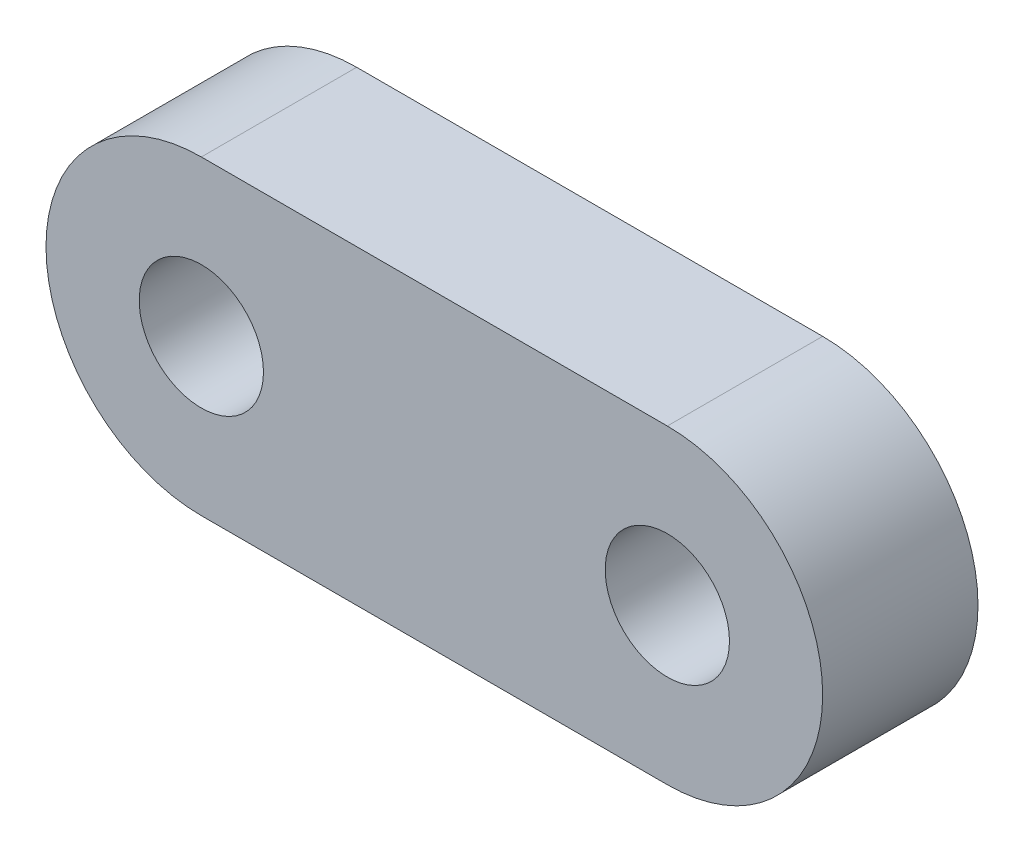
ISO-10303-21;
HEADER;
FILE_DESCRIPTION(('STEP AP214'),'2;1');
FILE_NAME('part.step','',(''),(''),'','','');
FILE_SCHEMA(('AUTOMOTIVE_DESIGN { 1 0 10303 214 1 1 1 1 }'));
ENDSEC;
DATA;
#1=APPLICATION_CONTEXT('core data for automotive mechanical design processes');
#2=APPLICATION_PROTOCOL_DEFINITION('international standard','automotive_design',2000,#1);
#3=PRODUCT_CONTEXT('',#1,'mechanical');
#4=PRODUCT('Part','Part','',(#3));
#5=PRODUCT_RELATED_PRODUCT_CATEGORY('part','',(#4));
#6=PRODUCT_DEFINITION_FORMATION('','',#4);
#7=PRODUCT_DEFINITION_CONTEXT('part definition',#1,'design');
#8=PRODUCT_DEFINITION('design','',#6,#7);
#9=PRODUCT_DEFINITION_SHAPE('','',#8);
#10=(LENGTH_UNIT() NAMED_UNIT(*) SI_UNIT(.MILLI.,.METRE.));
#11=(NAMED_UNIT(*) PLANE_ANGLE_UNIT() SI_UNIT($,.RADIAN.));
#12=(NAMED_UNIT(*) SI_UNIT($,.STERADIAN.) SOLID_ANGLE_UNIT());
#13=UNCERTAINTY_MEASURE_WITH_UNIT(LENGTH_MEASURE(1.E-05),#10,'distance_accuracy_value','');
#14=(GEOMETRIC_REPRESENTATION_CONTEXT(3) GLOBAL_UNCERTAINTY_ASSIGNED_CONTEXT((#13)) GLOBAL_UNIT_ASSIGNED_CONTEXT((#10,
#11,#12)) REPRESENTATION_CONTEXT('',''));
#15=CARTESIAN_POINT('',(0.,0.,0.));
#16=DIRECTION('',(0.,0.,1.));
#17=DIRECTION('',(1.,0.,0.));
#18=AXIS2_PLACEMENT_3D('',#15,#16,#17);
#19=CARTESIAN_POINT('',(-7.5,0.,2.5));
#20=DIRECTION('',(0.,0.,1.));
#21=DIRECTION('',(1.,0.,0.));
#22=AXIS2_PLACEMENT_3D('',#19,#20,#21);
#23=PLANE('',#22);
#24=CARTESIAN_POINT('',(7.5,0.,2.5));
#25=DIRECTION('',(0.,0.,1.));
#26=DIRECTION('',(1.,0.,0.));
#27=AXIS2_PLACEMENT_3D('',#24,#25,#26);
#28=CIRCLE('',#27,2.);
#29=CARTESIAN_POINT('',(9.5,0.,2.5));
#30=VERTEX_POINT('',#29);
#31=EDGE_CURVE('E112',#30,#30,#28,.T.);
#32=ORIENTED_EDGE('',*,*,#31,.F.);
#33=EDGE_LOOP('',(#32));
#34=FACE_BOUND('',#33,.T.);
#35=CARTESIAN_POINT('',(-7.5,0.,2.5));
#36=DIRECTION('',(0.,0.,1.));
#37=DIRECTION('',(1.,0.,0.));
#38=AXIS2_PLACEMENT_3D('',#35,#36,#37);
#39=CIRCLE('',#38,5.);
#40=CARTESIAN_POINT('',(-7.5,5.,2.5));
#41=VERTEX_POINT('',#40);
#42=CARTESIAN_POINT('',(-7.5,-5.,2.5));
#43=VERTEX_POINT('',#42);
#44=EDGE_CURVE('E92',#41,#43,#39,.T.);
#45=ORIENTED_EDGE('',*,*,#44,.T.);
#46=DIRECTION('',(1.,0.,0.));
#47=VECTOR('',#46,1.);
#48=CARTESIAN_POINT('',(-7.5,-5.,2.5));
#49=LINE('',#48,#47);
#50=CARTESIAN_POINT('',(7.5,-5.,2.5));
#51=VERTEX_POINT('',#50);
#52=EDGE_CURVE('E87',#43,#51,#49,.T.);
#53=ORIENTED_EDGE('',*,*,#52,.T.);
#54=CARTESIAN_POINT('',(7.5,0.,2.5));
#55=DIRECTION('',(0.,0.,1.));
#56=DIRECTION('',(1.,0.,0.));
#57=AXIS2_PLACEMENT_3D('',#54,#55,#56);
#58=CIRCLE('',#57,5.);
#59=CARTESIAN_POINT('',(7.5,5.,2.5));
#60=VERTEX_POINT('',#59);
#61=EDGE_CURVE('E90',#51,#60,#58,.T.);
#62=ORIENTED_EDGE('',*,*,#61,.T.);
#63=DIRECTION('',(-1.,0.,0.));
#64=VECTOR('',#63,1.);
#65=CARTESIAN_POINT('',(-7.5,5.,2.5));
#66=LINE('',#65,#64);
#67=EDGE_CURVE('E57',#60,#41,#66,.T.);
#68=ORIENTED_EDGE('',*,*,#67,.T.);
#69=EDGE_LOOP('',(#45,#53,#62,#68));
#70=FACE_BOUND('',#69,.T.);
#71=CARTESIAN_POINT('',(-7.5,0.,2.5));
#72=DIRECTION('',(0.,0.,1.));
#73=DIRECTION('',(1.,0.,0.));
#74=AXIS2_PLACEMENT_3D('',#71,#72,#73);
#75=CIRCLE('',#74,2.);
#76=CARTESIAN_POINT('',(-5.5,0.,2.5));
#77=VERTEX_POINT('',#76);
#78=EDGE_CURVE('E134',#77,#77,#75,.T.);
#79=ORIENTED_EDGE('',*,*,#78,.F.);
#80=EDGE_LOOP('',(#79));
#81=FACE_BOUND('',#80,.T.);
#82=ADVANCED_FACE('F39',(#34,#70,#81),#23,.T.);
#83=CARTESIAN_POINT('',(-7.5,0.,-2.5));
#84=DIRECTION('',(0.,0.,1.));
#85=DIRECTION('',(1.,0.,0.));
#86=AXIS2_PLACEMENT_3D('',#83,#84,#85);
#87=PLANE('',#86);
#88=CARTESIAN_POINT('',(-7.5,0.,-2.5));
#89=DIRECTION('',(0.,0.,1.));
#90=DIRECTION('',(1.,0.,0.));
#91=AXIS2_PLACEMENT_3D('',#88,#89,#90);
#92=CIRCLE('',#91,5.);
#93=CARTESIAN_POINT('',(-7.5,5.,-2.5));
#94=VERTEX_POINT('',#93);
#95=CARTESIAN_POINT('',(-7.5,-5.,-2.5));
#96=VERTEX_POINT('',#95);
#97=EDGE_CURVE('E108',#94,#96,#92,.T.);
#98=ORIENTED_EDGE('',*,*,#97,.F.);
#99=DIRECTION('',(-1.,0.,0.));
#100=VECTOR('',#99,1.);
#101=CARTESIAN_POINT('',(-7.5,5.,-2.5));
#102=LINE('',#101,#100);
#103=CARTESIAN_POINT('',(7.5,5.,-2.5));
#104=VERTEX_POINT('',#103);
#105=EDGE_CURVE('E80',#104,#94,#102,.T.);
#106=ORIENTED_EDGE('',*,*,#105,.F.);
#107=CARTESIAN_POINT('',(7.5,0.,-2.5));
#108=DIRECTION('',(0.,0.,1.));
#109=DIRECTION('',(1.,0.,0.));
#110=AXIS2_PLACEMENT_3D('',#107,#108,#109);
#111=CIRCLE('',#110,5.);
#112=CARTESIAN_POINT('',(7.5,-5.,-2.5));
#113=VERTEX_POINT('',#112);
#114=EDGE_CURVE('E74',#113,#104,#111,.T.);
#115=ORIENTED_EDGE('',*,*,#114,.F.);
#116=DIRECTION('',(1.,0.,0.));
#117=VECTOR('',#116,1.);
#118=CARTESIAN_POINT('',(-7.5,-5.,-2.5));
#119=LINE('',#118,#117);
#120=EDGE_CURVE('E97',#96,#113,#119,.T.);
#121=ORIENTED_EDGE('',*,*,#120,.F.);
#122=EDGE_LOOP('',(#98,#106,#115,#121));
#123=FACE_BOUND('',#122,.T.);
#124=CARTESIAN_POINT('',(7.5,0.,-2.5));
#125=DIRECTION('',(0.,0.,1.));
#126=DIRECTION('',(1.,0.,0.));
#127=AXIS2_PLACEMENT_3D('',#124,#125,#126);
#128=CIRCLE('',#127,2.);
#129=CARTESIAN_POINT('',(9.5,0.,-2.5));
#130=VERTEX_POINT('',#129);
#131=EDGE_CURVE('E130',#130,#130,#128,.T.);
#132=ORIENTED_EDGE('',*,*,#131,.T.);
#133=EDGE_LOOP('',(#132));
#134=FACE_BOUND('',#133,.T.);
#135=CARTESIAN_POINT('',(-7.5,0.,-2.5));
#136=DIRECTION('',(0.,0.,1.));
#137=DIRECTION('',(1.,0.,0.));
#138=AXIS2_PLACEMENT_3D('',#135,#136,#137);
#139=CIRCLE('',#138,2.);
#140=CARTESIAN_POINT('',(-5.5,0.,-2.5));
#141=VERTEX_POINT('',#140);
#142=EDGE_CURVE('E138',#141,#141,#139,.T.);
#143=ORIENTED_EDGE('',*,*,#142,.T.);
#144=EDGE_LOOP('',(#143));
#145=FACE_BOUND('',#144,.T.);
#146=ADVANCED_FACE('F125',(#123,#134,#145),#87,.F.);
#147=CARTESIAN_POINT('',(-7.5,0.,2.5));
#148=DIRECTION('',(0.,0.,-1.));
#149=DIRECTION('',(-1.,0.,0.));
#150=AXIS2_PLACEMENT_3D('',#147,#148,#149);
#151=CYLINDRICAL_SURFACE('',#150,5.);
#152=ORIENTED_EDGE('',*,*,#97,.T.);
#153=DIRECTION('',(0.,0.,-1.));
#154=VECTOR('',#153,1.);
#155=CARTESIAN_POINT('',(-7.5,-5.,2.5));
#156=LINE('',#155,#154);
#157=EDGE_CURVE('E11',#43,#96,#156,.T.);
#158=ORIENTED_EDGE('',*,*,#157,.F.);
#159=ORIENTED_EDGE('',*,*,#44,.F.);
#160=DIRECTION('',(0.,0.,-1.));
#161=VECTOR('',#160,1.);
#162=CARTESIAN_POINT('',(-7.5,5.,2.5));
#163=LINE('',#162,#161);
#164=EDGE_CURVE('E104',#41,#94,#163,.T.);
#165=ORIENTED_EDGE('',*,*,#164,.T.);
#166=EDGE_LOOP('',(#152,#158,#159,#165));
#167=FACE_BOUND('',#166,.T.);
#168=ADVANCED_FACE('F41',(#167),#151,.T.);
#169=CARTESIAN_POINT('',(-7.5,-5.,2.5));
#170=DIRECTION('',(0.,1.,0.));
#171=DIRECTION('',(-1.,0.,0.));
#172=AXIS2_PLACEMENT_3D('',#169,#170,#171);
#173=PLANE('',#172);
#174=ORIENTED_EDGE('',*,*,#120,.T.);
#175=DIRECTION('',(0.,0.,-1.));
#176=VECTOR('',#175,1.);
#177=CARTESIAN_POINT('',(7.5,-5.,2.5));
#178=LINE('',#177,#176);
#179=EDGE_CURVE('E49',#51,#113,#178,.T.);
#180=ORIENTED_EDGE('',*,*,#179,.F.);
#181=ORIENTED_EDGE('',*,*,#52,.F.);
#182=ORIENTED_EDGE('',*,*,#157,.T.);
#183=EDGE_LOOP('',(#174,#180,#181,#182));
#184=FACE_BOUND('',#183,.T.);
#185=ADVANCED_FACE('F96',(#184),#173,.F.);
#186=CARTESIAN_POINT('',(7.5,0.,2.5));
#187=DIRECTION('',(0.,0.,-1.));
#188=DIRECTION('',(-1.,0.,0.));
#189=AXIS2_PLACEMENT_3D('',#186,#187,#188);
#190=CYLINDRICAL_SURFACE('',#189,5.);
#191=ORIENTED_EDGE('',*,*,#114,.T.);
#192=DIRECTION('',(0.,0.,-1.));
#193=VECTOR('',#192,1.);
#194=CARTESIAN_POINT('',(7.5,5.,2.5));
#195=LINE('',#194,#193);
#196=EDGE_CURVE('E99',#60,#104,#195,.T.);
#197=ORIENTED_EDGE('',*,*,#196,.F.);
#198=ORIENTED_EDGE('',*,*,#61,.F.);
#199=ORIENTED_EDGE('',*,*,#179,.T.);
#200=EDGE_LOOP('',(#191,#197,#198,#199));
#201=FACE_BOUND('',#200,.T.);
#202=ADVANCED_FACE('F100',(#201),#190,.T.);
#203=CARTESIAN_POINT('',(-7.5,5.,2.5));
#204=DIRECTION('',(0.,-1.,0.));
#205=DIRECTION('',(1.,0.,0.));
#206=AXIS2_PLACEMENT_3D('',#203,#204,#205);
#207=PLANE('',#206);
#208=ORIENTED_EDGE('',*,*,#105,.T.);
#209=ORIENTED_EDGE('',*,*,#164,.F.);
#210=ORIENTED_EDGE('',*,*,#67,.F.);
#211=ORIENTED_EDGE('',*,*,#196,.T.);
#212=EDGE_LOOP('',(#208,#209,#210,#211));
#213=FACE_BOUND('',#212,.T.);
#214=ADVANCED_FACE('F122',(#213),#207,.F.);
#215=CARTESIAN_POINT('',(7.5,0.,2.5));
#216=DIRECTION('',(0.,0.,-1.));
#217=DIRECTION('',(-1.,0.,0.));
#218=AXIS2_PLACEMENT_3D('',#215,#216,#217);
#219=CYLINDRICAL_SURFACE('',#218,2.);
#220=ORIENTED_EDGE('',*,*,#31,.T.);
#221=EDGE_LOOP('',(#220));
#222=FACE_BOUND('',#221,.T.);
#223=ORIENTED_EDGE('',*,*,#131,.F.);
#224=EDGE_LOOP('',(#223));
#225=FACE_BOUND('',#224,.T.);
#226=ADVANCED_FACE('F157',(#222,#225),#219,.F.);
#227=CARTESIAN_POINT('',(-7.5,0.,2.5));
#228=DIRECTION('',(0.,0.,-1.));
#229=DIRECTION('',(-1.,0.,0.));
#230=AXIS2_PLACEMENT_3D('',#227,#228,#229);
#231=CYLINDRICAL_SURFACE('',#230,2.);
#232=ORIENTED_EDGE('',*,*,#78,.T.);
#233=EDGE_LOOP('',(#232));
#234=FACE_BOUND('',#233,.T.);
#235=ORIENTED_EDGE('',*,*,#142,.F.);
#236=EDGE_LOOP('',(#235));
#237=FACE_BOUND('',#236,.T.);
#238=ADVANCED_FACE('F146',(#234,#237),#231,.F.);
#239=CLOSED_SHELL('',(#82,#146,#168,#185,#202,#214,#226,#238));
#240=MANIFOLD_SOLID_BREP('B2',#239);
#241=ADVANCED_BREP_SHAPE_REPRESENTATION('',(#18,#240),#14);
#242=SHAPE_DEFINITION_REPRESENTATION(#9,#241);
ENDSEC;
END-ISO-10303-21;
